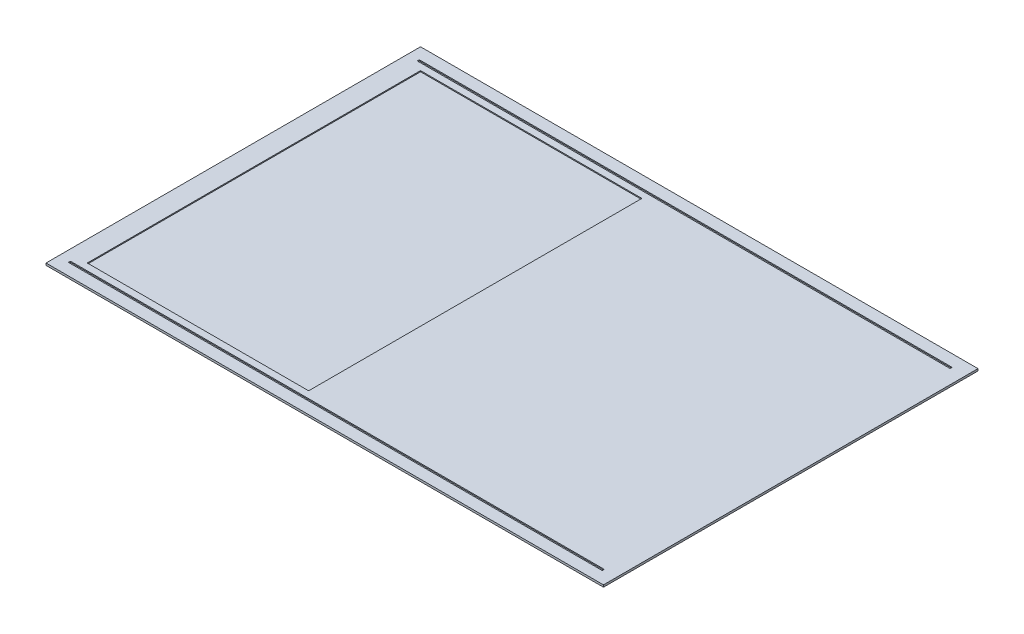
ISO-10303-21;
HEADER;
FILE_DESCRIPTION(('STEP AP214'),'2;1');
FILE_NAME('part.step','',(''),(''),'','','');
FILE_SCHEMA(('AUTOMOTIVE_DESIGN { 1 0 10303 214 1 1 1 1 }'));
ENDSEC;
DATA;
#1=APPLICATION_CONTEXT('core data for automotive mechanical design processes');
#2=APPLICATION_PROTOCOL_DEFINITION('international standard','automotive_design',2000,#1);
#3=PRODUCT_CONTEXT('',#1,'mechanical');
#4=PRODUCT('Part','Part','',(#3));
#5=PRODUCT_RELATED_PRODUCT_CATEGORY('part','',(#4));
#6=PRODUCT_DEFINITION_FORMATION('','',#4);
#7=PRODUCT_DEFINITION_CONTEXT('part definition',#1,'design');
#8=PRODUCT_DEFINITION('design','',#6,#7);
#9=PRODUCT_DEFINITION_SHAPE('','',#8);
#10=(LENGTH_UNIT() NAMED_UNIT(*) SI_UNIT(.MILLI.,.METRE.));
#11=(NAMED_UNIT(*) PLANE_ANGLE_UNIT() SI_UNIT($,.RADIAN.));
#12=(NAMED_UNIT(*) SI_UNIT($,.STERADIAN.) SOLID_ANGLE_UNIT());
#13=UNCERTAINTY_MEASURE_WITH_UNIT(LENGTH_MEASURE(1.E-05),#10,'distance_accuracy_value','');
#14=(GEOMETRIC_REPRESENTATION_CONTEXT(3) GLOBAL_UNCERTAINTY_ASSIGNED_CONTEXT((#13)) GLOBAL_UNIT_ASSIGNED_CONTEXT((#10,
#11,#12)) REPRESENTATION_CONTEXT('',''));
#15=CARTESIAN_POINT('',(0.,0.,0.));
#16=DIRECTION('',(0.,0.,1.));
#17=DIRECTION('',(1.,0.,0.));
#18=AXIS2_PLACEMENT_3D('',#15,#16,#17);
#19=CARTESIAN_POINT('',(0.,20.,0.));
#20=DIRECTION('',(0.,1.,0.));
#21=DIRECTION('',(0.,0.,1.));
#22=AXIS2_PLACEMENT_3D('',#19,#20,#21);
#23=PLANE('',#22);
#24=DIRECTION('',(0.,0.,1.));
#25=VECTOR('',#24,1.);
#26=CARTESIAN_POINT('',(-2700.13226016902,20.,709.245671205346));
#27=LINE('',#26,#25);
#28=CARTESIAN_POINT('',(-2700.13226016902,20.,709.245671205346));
#29=VERTEX_POINT('',#28);
#30=CARTESIAN_POINT('',(-2700.13226016902,20.,729.245671205346));
#31=VERTEX_POINT('',#30);
#32=EDGE_CURVE('E158',#29,#31,#27,.T.);
#33=ORIENTED_EDGE('',*,*,#32,.F.);
#34=DIRECTION('',(1.,0.,0.));
#35=VECTOR('',#34,1.);
#36=CARTESIAN_POINT('',(-2700.13226016902,20.,709.245671205346));
#37=LINE('',#36,#35);
#38=CARTESIAN_POINT('',(2460.61811379552,20.,709.245671205346));
#39=VERTEX_POINT('',#38);
#40=EDGE_CURVE('E174',#29,#39,#37,.T.);
#41=ORIENTED_EDGE('',*,*,#40,.T.);
#42=DIRECTION('',(0.,0.,-1.));
#43=VECTOR('',#42,1.);
#44=CARTESIAN_POINT('',(2460.61811379552,20.,729.245671205346));
#45=LINE('',#44,#43);
#46=CARTESIAN_POINT('',(2460.61811379552,20.,729.245671205346));
#47=VERTEX_POINT('',#46);
#48=EDGE_CURVE('E181',#47,#39,#45,.T.);
#49=ORIENTED_EDGE('',*,*,#48,.F.);
#50=DIRECTION('',(1.,0.,0.));
#51=VECTOR('',#50,1.);
#52=CARTESIAN_POINT('',(-2700.13226016902,20.,729.245671205346));
#53=LINE('',#52,#51);
#54=EDGE_CURVE('E179',#31,#47,#53,.T.);
#55=ORIENTED_EDGE('',*,*,#54,.F.);
#56=EDGE_LOOP('',(#33,#41,#49,#55));
#57=FACE_BOUND('',#56,.T.);
#58=DIRECTION('',(1.,0.,0.));
#59=VECTOR('',#58,1.);
#60=CARTESIAN_POINT('',(0.,20.,4022.65256797583));
#61=LINE('',#60,#59);
#62=CARTESIAN_POINT('',(-2603.77643504532,20.,4022.65256797583));
#63=VERTEX_POINT('',#62);
#64=CARTESIAN_POINT('',(-459.676435045316,20.,4022.65256797583));
#65=VERTEX_POINT('',#64);
#66=EDGE_CURVE('E229',#63,#65,#61,.T.);
#67=ORIENTED_EDGE('',*,*,#66,.F.);
#68=DIRECTION('',(0.,0.,1.));
#69=VECTOR('',#68,1.);
#70=CARTESIAN_POINT('',(-2603.77643504532,20.,7.16424423584565E-13));
#71=LINE('',#70,#69);
#72=CARTESIAN_POINT('',(-2603.77643504532,20.,794.652567975834));
#73=VERTEX_POINT('',#72);
#74=EDGE_CURVE('E232',#73,#63,#71,.T.);
#75=ORIENTED_EDGE('',*,*,#74,.F.);
#76=DIRECTION('',(1.,0.,0.));
#77=VECTOR('',#76,1.);
#78=CARTESIAN_POINT('',(0.,20.,794.652567975834));
#79=LINE('',#78,#77);
#80=CARTESIAN_POINT('',(-459.676435045317,20.,794.652567975834));
#81=VERTEX_POINT('',#80);
#82=EDGE_CURVE('E236',#73,#81,#79,.T.);
#83=ORIENTED_EDGE('',*,*,#82,.T.);
#84=DIRECTION('',(0.,0.,1.));
#85=VECTOR('',#84,1.);
#86=CARTESIAN_POINT('',(-459.676435045317,20.,0.));
#87=LINE('',#86,#85);
#88=EDGE_CURVE('E238',#81,#65,#87,.T.);
#89=ORIENTED_EDGE('',*,*,#88,.T.);
#90=EDGE_LOOP('',(#67,#75,#83,#89));
#91=FACE_BOUND('',#90,.T.);
#92=DIRECTION('',(1.,0.,0.));
#93=VECTOR('',#92,1.);
#94=CARTESIAN_POINT('',(0.,20.,4222.65256797583));
#95=LINE('',#94,#93);
#96=CARTESIAN_POINT('',(-2803.77643504532,20.,4222.65256797583));
#97=VERTEX_POINT('',#96);
#98=CARTESIAN_POINT('',(2596.22356495468,20.,4222.65256797583));
#99=VERTEX_POINT('',#98);
#100=EDGE_CURVE('E240',#97,#99,#95,.T.);
#101=ORIENTED_EDGE('',*,*,#100,.T.);
#102=DIRECTION('',(0.,0.,-1.));
#103=VECTOR('',#102,1.);
#104=CARTESIAN_POINT('',(2596.22356495468,20.,0.));
#105=LINE('',#104,#103);
#106=CARTESIAN_POINT('',(2596.22356495468,20.,594.652567975834));
#107=VERTEX_POINT('',#106);
#108=EDGE_CURVE('E243',#99,#107,#105,.T.);
#109=ORIENTED_EDGE('',*,*,#108,.T.);
#110=DIRECTION('',(-1.,0.,0.));
#111=VECTOR('',#110,1.);
#112=CARTESIAN_POINT('',(0.,20.,594.652567975835));
#113=LINE('',#112,#111);
#114=CARTESIAN_POINT('',(-2803.77643504532,20.,594.652567975835));
#115=VERTEX_POINT('',#114);
#116=EDGE_CURVE('E245',#107,#115,#113,.T.);
#117=ORIENTED_EDGE('',*,*,#116,.T.);
#118=DIRECTION('',(0.,0.,1.));
#119=VECTOR('',#118,1.);
#120=CARTESIAN_POINT('',(-2803.77643504532,20.,6.86398490427509E-13));
#121=LINE('',#120,#119);
#122=EDGE_CURVE('E247',#115,#97,#121,.T.);
#123=ORIENTED_EDGE('',*,*,#122,.T.);
#124=EDGE_LOOP('',(#101,#109,#117,#123));
#125=FACE_BOUND('',#124,.T.);
#126=DIRECTION('',(0.,0.,1.));
#127=VECTOR('',#126,1.);
#128=CARTESIAN_POINT('',(-2700.13226016902,20.,4088.65256797583));
#129=LINE('',#128,#127);
#130=CARTESIAN_POINT('',(-2700.13226016902,20.,4088.65256797583));
#131=VERTEX_POINT('',#130);
#132=CARTESIAN_POINT('',(-2700.13226016902,20.,4108.65256797583));
#133=VERTEX_POINT('',#132);
#134=EDGE_CURVE('E202',#131,#133,#129,.T.);
#135=ORIENTED_EDGE('',*,*,#134,.F.);
#136=DIRECTION('',(1.,0.,0.));
#137=VECTOR('',#136,1.);
#138=CARTESIAN_POINT('',(-2700.13226016902,20.,4088.65256797583));
#139=LINE('',#138,#137);
#140=CARTESIAN_POINT('',(2470.6647592355,20.,4088.65256797583));
#141=VERTEX_POINT('',#140);
#142=EDGE_CURVE('E62',#131,#141,#139,.T.);
#143=ORIENTED_EDGE('',*,*,#142,.T.);
#144=DIRECTION('',(0.,0.,1.));
#145=VECTOR('',#144,1.);
#146=CARTESIAN_POINT('',(2470.6647592355,20.,4088.65256797583));
#147=LINE('',#146,#145);
#148=CARTESIAN_POINT('',(2470.6647592355,20.,4108.65256797583));
#149=VERTEX_POINT('',#148);
#150=EDGE_CURVE('E208',#141,#149,#147,.T.);
#151=ORIENTED_EDGE('',*,*,#150,.T.);
#152=DIRECTION('',(1.,0.,0.));
#153=VECTOR('',#152,1.);
#154=CARTESIAN_POINT('',(-2700.13226016902,20.,4108.65256797583));
#155=LINE('',#154,#153);
#156=EDGE_CURVE('E204',#133,#149,#155,.T.);
#157=ORIENTED_EDGE('',*,*,#156,.F.);
#158=EDGE_LOOP('',(#135,#143,#151,#157));
#159=FACE_BOUND('',#158,.T.);
#160=ADVANCED_FACE('F37',(#57,#91,#125,#159),#23,.T.);
#161=CARTESIAN_POINT('',(0.,20.,4222.65256797583));
#162=DIRECTION('',(0.,0.,-1.));
#163=DIRECTION('',(-1.,0.,0.));
#164=AXIS2_PLACEMENT_3D('',#161,#162,#163);
#165=PLANE('',#164);
#166=DIRECTION('',(1.,0.,0.));
#167=VECTOR('',#166,1.);
#168=CARTESIAN_POINT('',(0.,0.,4222.65256797583));
#169=LINE('',#168,#167);
#170=CARTESIAN_POINT('',(-2803.77643504532,0.,4222.65256797583));
#171=VERTEX_POINT('',#170);
#172=CARTESIAN_POINT('',(2596.22356495468,0.,4222.65256797583));
#173=VERTEX_POINT('',#172);
#174=EDGE_CURVE('E228',#171,#173,#169,.T.);
#175=ORIENTED_EDGE('',*,*,#174,.T.);
#176=DIRECTION('',(0.,-1.,0.));
#177=VECTOR('',#176,1.);
#178=CARTESIAN_POINT('',(2596.22356495468,20.,4222.65256797583));
#179=LINE('',#178,#177);
#180=EDGE_CURVE('E11',#99,#173,#179,.T.);
#181=ORIENTED_EDGE('',*,*,#180,.F.);
#182=ORIENTED_EDGE('',*,*,#100,.F.);
#183=DIRECTION('',(0.,-1.,0.));
#184=VECTOR('',#183,1.);
#185=CARTESIAN_POINT('',(-2803.77643504532,20.,4222.65256797583));
#186=LINE('',#185,#184);
#187=EDGE_CURVE('E257',#97,#171,#186,.T.);
#188=ORIENTED_EDGE('',*,*,#187,.T.);
#189=EDGE_LOOP('',(#175,#181,#182,#188));
#190=FACE_BOUND('',#189,.T.);
#191=ADVANCED_FACE('F302',(#190),#165,.F.);
#192=CARTESIAN_POINT('',(2596.22356495468,20.,0.));
#193=DIRECTION('',(-1.,0.,0.));
#194=DIRECTION('',(0.,0.,1.));
#195=AXIS2_PLACEMENT_3D('',#192,#193,#194);
#196=PLANE('',#195);
#197=DIRECTION('',(0.,0.,-1.));
#198=VECTOR('',#197,1.);
#199=CARTESIAN_POINT('',(2596.22356495468,0.,0.));
#200=LINE('',#199,#198);
#201=CARTESIAN_POINT('',(2596.22356495468,0.,594.652567975834));
#202=VERTEX_POINT('',#201);
#203=EDGE_CURVE('E252',#173,#202,#200,.T.);
#204=ORIENTED_EDGE('',*,*,#203,.T.);
#205=DIRECTION('',(0.,-1.,0.));
#206=VECTOR('',#205,1.);
#207=CARTESIAN_POINT('',(2596.22356495468,20.,594.652567975834));
#208=LINE('',#207,#206);
#209=EDGE_CURVE('E46',#107,#202,#208,.T.);
#210=ORIENTED_EDGE('',*,*,#209,.F.);
#211=ORIENTED_EDGE('',*,*,#108,.F.);
#212=ORIENTED_EDGE('',*,*,#180,.T.);
#213=EDGE_LOOP('',(#204,#210,#211,#212));
#214=FACE_BOUND('',#213,.T.);
#215=ADVANCED_FACE('F310',(#214),#196,.F.);
#216=CARTESIAN_POINT('',(0.,20.,594.652567975835));
#217=DIRECTION('',(0.,0.,1.));
#218=DIRECTION('',(1.,0.,0.));
#219=AXIS2_PLACEMENT_3D('',#216,#217,#218);
#220=PLANE('',#219);
#221=DIRECTION('',(-1.,0.,0.));
#222=VECTOR('',#221,1.);
#223=CARTESIAN_POINT('',(0.,0.,594.652567975835));
#224=LINE('',#223,#222);
#225=CARTESIAN_POINT('',(-2803.77643504532,0.,594.652567975835));
#226=VERTEX_POINT('',#225);
#227=EDGE_CURVE('E254',#202,#226,#224,.T.);
#228=ORIENTED_EDGE('',*,*,#227,.T.);
#229=DIRECTION('',(0.,-1.,0.));
#230=VECTOR('',#229,1.);
#231=CARTESIAN_POINT('',(-2803.77643504532,20.,594.652567975835));
#232=LINE('',#231,#230);
#233=EDGE_CURVE('E260',#115,#226,#232,.T.);
#234=ORIENTED_EDGE('',*,*,#233,.F.);
#235=ORIENTED_EDGE('',*,*,#116,.F.);
#236=ORIENTED_EDGE('',*,*,#209,.T.);
#237=EDGE_LOOP('',(#228,#234,#235,#236));
#238=FACE_BOUND('',#237,.T.);
#239=ADVANCED_FACE('F323',(#238),#220,.F.);
#240=CARTESIAN_POINT('',(0.,20.,4022.65256797583));
#241=DIRECTION('',(0.,0.,-1.));
#242=DIRECTION('',(-1.,0.,0.));
#243=AXIS2_PLACEMENT_3D('',#240,#241,#242);
#244=PLANE('',#243);
#245=DIRECTION('',(1.,0.,0.));
#246=VECTOR('',#245,1.);
#247=CARTESIAN_POINT('',(-2603.77643504532,10.,4022.65256797583));
#248=LINE('',#247,#246);
#249=CARTESIAN_POINT('',(-2603.77643504532,10.,4022.65256797583));
#250=VERTEX_POINT('',#249);
#251=CARTESIAN_POINT('',(-459.676435045316,10.,4022.65256797583));
#252=VERTEX_POINT('',#251);
#253=EDGE_CURVE('E222',#250,#252,#248,.T.);
#254=ORIENTED_EDGE('',*,*,#253,.F.);
#255=DIRECTION('',(0.,-1.,0.));
#256=VECTOR('',#255,1.);
#257=CARTESIAN_POINT('',(-2603.77643504532,20.,4022.65256797583));
#258=LINE('',#257,#256);
#259=EDGE_CURVE('E41',#63,#250,#258,.T.);
#260=ORIENTED_EDGE('',*,*,#259,.F.);
#261=ORIENTED_EDGE('',*,*,#66,.T.);
#262=DIRECTION('',(0.,-1.,0.));
#263=VECTOR('',#262,1.);
#264=CARTESIAN_POINT('',(-459.676435045316,20.,4022.65256797583));
#265=LINE('',#264,#263);
#266=EDGE_CURVE('E249',#65,#252,#265,.T.);
#267=ORIENTED_EDGE('',*,*,#266,.T.);
#268=EDGE_LOOP('',(#254,#260,#261,#267));
#269=FACE_BOUND('',#268,.T.);
#270=ADVANCED_FACE('F39',(#269),#244,.T.);
#271=CARTESIAN_POINT('',(-2603.77643504532,20.,7.16424423584565E-13));
#272=DIRECTION('',(1.,0.,0.));
#273=DIRECTION('',(0.,0.,-1.));
#274=AXIS2_PLACEMENT_3D('',#271,#272,#273);
#275=PLANE('',#274);
#276=DIRECTION('',(0.,0.,1.));
#277=VECTOR('',#276,1.);
#278=CARTESIAN_POINT('',(-2603.77643504532,10.,794.652567975834));
#279=LINE('',#278,#277);
#280=CARTESIAN_POINT('',(-2603.77643504532,10.,794.652567975834));
#281=VERTEX_POINT('',#280);
#282=EDGE_CURVE('E188',#281,#250,#279,.T.);
#283=ORIENTED_EDGE('',*,*,#282,.F.);
#284=DIRECTION('',(0.,-1.,0.));
#285=VECTOR('',#284,1.);
#286=CARTESIAN_POINT('',(-2603.77643504532,20.,794.652567975834));
#287=LINE('',#286,#285);
#288=EDGE_CURVE('E269',#73,#281,#287,.T.);
#289=ORIENTED_EDGE('',*,*,#288,.F.);
#290=ORIENTED_EDGE('',*,*,#74,.T.);
#291=ORIENTED_EDGE('',*,*,#259,.T.);
#292=EDGE_LOOP('',(#283,#289,#290,#291));
#293=FACE_BOUND('',#292,.T.);
#294=ADVANCED_FACE('F277',(#293),#275,.T.);
#295=CARTESIAN_POINT('',(0.,20.,794.652567975834));
#296=DIRECTION('',(0.,0.,-1.));
#297=DIRECTION('',(-1.,0.,0.));
#298=AXIS2_PLACEMENT_3D('',#295,#296,#297);
#299=PLANE('',#298);
#300=ORIENTED_EDGE('',*,*,#288,.T.);
#301=DIRECTION('',(-1.,0.,0.));
#302=VECTOR('',#301,1.);
#303=CARTESIAN_POINT('',(-2603.77643504532,10.,794.652567975834));
#304=LINE('',#303,#302);
#305=CARTESIAN_POINT('',(-459.676435045316,10.,794.652567975834));
#306=VERTEX_POINT('',#305);
#307=EDGE_CURVE('E226',#306,#281,#304,.T.);
#308=ORIENTED_EDGE('',*,*,#307,.F.);
#309=DIRECTION('',(0.,-1.,0.));
#310=VECTOR('',#309,1.);
#311=CARTESIAN_POINT('',(-459.676435045317,20.,794.652567975834));
#312=LINE('',#311,#310);
#313=EDGE_CURVE('E267',#81,#306,#312,.T.);
#314=ORIENTED_EDGE('',*,*,#313,.F.);
#315=ORIENTED_EDGE('',*,*,#82,.F.);
#316=EDGE_LOOP('',(#300,#308,#314,#315));
#317=FACE_BOUND('',#316,.T.);
#318=ADVANCED_FACE('F292',(#317),#299,.F.);
#319=CARTESIAN_POINT('',(-459.676435045317,20.,0.));
#320=DIRECTION('',(1.,0.,0.));
#321=DIRECTION('',(0.,0.,-1.));
#322=AXIS2_PLACEMENT_3D('',#319,#320,#321);
#323=PLANE('',#322);
#324=ORIENTED_EDGE('',*,*,#313,.T.);
#325=DIRECTION('',(0.,0.,-1.));
#326=VECTOR('',#325,1.);
#327=CARTESIAN_POINT('',(-459.676435045316,10.,794.652567975834));
#328=LINE('',#327,#326);
#329=EDGE_CURVE('E224',#252,#306,#328,.T.);
#330=ORIENTED_EDGE('',*,*,#329,.F.);
#331=ORIENTED_EDGE('',*,*,#266,.F.);
#332=ORIENTED_EDGE('',*,*,#88,.F.);
#333=EDGE_LOOP('',(#324,#330,#331,#332));
#334=FACE_BOUND('',#333,.T.);
#335=ADVANCED_FACE('F289',(#334),#323,.F.);
#336=CARTESIAN_POINT('',(-2803.77643504532,20.,6.86398490427509E-13));
#337=DIRECTION('',(1.,0.,0.));
#338=DIRECTION('',(0.,0.,-1.));
#339=AXIS2_PLACEMENT_3D('',#336,#337,#338);
#340=PLANE('',#339);
#341=DIRECTION('',(0.,0.,1.));
#342=VECTOR('',#341,1.);
#343=CARTESIAN_POINT('',(-2803.77643504532,0.,6.86398490427509E-13));
#344=LINE('',#343,#342);
#345=EDGE_CURVE('E233',#226,#171,#344,.T.);
#346=ORIENTED_EDGE('',*,*,#345,.T.);
#347=ORIENTED_EDGE('',*,*,#187,.F.);
#348=ORIENTED_EDGE('',*,*,#122,.F.);
#349=ORIENTED_EDGE('',*,*,#233,.T.);
#350=EDGE_LOOP('',(#346,#347,#348,#349));
#351=FACE_BOUND('',#350,.T.);
#352=ADVANCED_FACE('F299',(#351),#340,.F.);
#353=CARTESIAN_POINT('',(0.,0.,0.));
#354=DIRECTION('',(0.,1.,0.));
#355=DIRECTION('',(0.,0.,1.));
#356=AXIS2_PLACEMENT_3D('',#353,#354,#355);
#357=PLANE('',#356);
#358=ORIENTED_EDGE('',*,*,#174,.F.);
#359=ORIENTED_EDGE('',*,*,#345,.F.);
#360=ORIENTED_EDGE('',*,*,#227,.F.);
#361=ORIENTED_EDGE('',*,*,#203,.F.);
#362=EDGE_LOOP('',(#358,#359,#360,#361));
#363=FACE_BOUND('',#362,.T.);
#364=ADVANCED_FACE('F316',(#363),#357,.F.);
#365=CARTESIAN_POINT('',(0.,10.,0.));
#366=DIRECTION('',(0.,1.,0.));
#367=DIRECTION('',(0.,0.,1.));
#368=AXIS2_PLACEMENT_3D('',#365,#366,#367);
#369=PLANE('',#368);
#370=ORIENTED_EDGE('',*,*,#282,.T.);
#371=ORIENTED_EDGE('',*,*,#253,.T.);
#372=ORIENTED_EDGE('',*,*,#329,.T.);
#373=ORIENTED_EDGE('',*,*,#307,.T.);
#374=EDGE_LOOP('',(#370,#371,#372,#373));
#375=FACE_BOUND('',#374,.T.);
#376=ADVANCED_FACE('F291',(#375),#369,.T.);
#377=CARTESIAN_POINT('',(-2700.13226016902,10.,4088.65256797583));
#378=DIRECTION('',(0.,0.,1.));
#379=DIRECTION('',(1.,0.,0.));
#380=AXIS2_PLACEMENT_3D('',#377,#378,#379);
#381=PLANE('',#380);
#382=ORIENTED_EDGE('',*,*,#142,.F.);
#383=DIRECTION('',(0.,1.,0.));
#384=VECTOR('',#383,1.);
#385=CARTESIAN_POINT('',(-2700.13226016902,10.,4088.65256797583));
#386=LINE('',#385,#384);
#387=CARTESIAN_POINT('',(-2700.13226016902,10.,4088.65256797583));
#388=VERTEX_POINT('',#387);
#389=EDGE_CURVE('E199',#388,#131,#386,.T.);
#390=ORIENTED_EDGE('',*,*,#389,.F.);
#391=DIRECTION('',(1.,0.,0.));
#392=VECTOR('',#391,1.);
#393=CARTESIAN_POINT('',(-2700.13226016902,10.,4088.65256797583));
#394=LINE('',#393,#392);
#395=CARTESIAN_POINT('',(2470.6647592355,10.,4088.65256797583));
#396=VERTEX_POINT('',#395);
#397=EDGE_CURVE('E205',#388,#396,#394,.T.);
#398=ORIENTED_EDGE('',*,*,#397,.T.);
#399=DIRECTION('',(0.,1.,0.));
#400=VECTOR('',#399,1.);
#401=CARTESIAN_POINT('',(2470.6647592355,10.,4088.65256797583));
#402=LINE('',#401,#400);
#403=EDGE_CURVE('E192',#396,#141,#402,.T.);
#404=ORIENTED_EDGE('',*,*,#403,.T.);
#405=EDGE_LOOP('',(#382,#390,#398,#404));
#406=FACE_BOUND('',#405,.T.);
#407=ADVANCED_FACE('F353',(#406),#381,.T.);
#408=CARTESIAN_POINT('',(2470.6647592355,10.,4088.65256797583));
#409=DIRECTION('',(-1.,0.,0.));
#410=DIRECTION('',(0.,0.,1.));
#411=AXIS2_PLACEMENT_3D('',#408,#409,#410);
#412=PLANE('',#411);
#413=ORIENTED_EDGE('',*,*,#150,.F.);
#414=ORIENTED_EDGE('',*,*,#403,.F.);
#415=DIRECTION('',(0.,0.,1.));
#416=VECTOR('',#415,1.);
#417=CARTESIAN_POINT('',(2470.6647592355,10.,4088.65256797583));
#418=LINE('',#417,#416);
#419=CARTESIAN_POINT('',(2470.6647592355,10.,4108.65256797583));
#420=VERTEX_POINT('',#419);
#421=EDGE_CURVE('E217',#396,#420,#418,.T.);
#422=ORIENTED_EDGE('',*,*,#421,.T.);
#423=DIRECTION('',(0.,1.,0.));
#424=VECTOR('',#423,1.);
#425=CARTESIAN_POINT('',(2470.6647592355,10.,4108.65256797583));
#426=LINE('',#425,#424);
#427=EDGE_CURVE('E194',#420,#149,#426,.T.);
#428=ORIENTED_EDGE('',*,*,#427,.T.);
#429=EDGE_LOOP('',(#413,#414,#422,#428));
#430=FACE_BOUND('',#429,.T.);
#431=ADVANCED_FACE('F356',(#430),#412,.T.);
#432=CARTESIAN_POINT('',(-2700.13226016902,10.,4108.65256797583));
#433=DIRECTION('',(0.,0.,1.));
#434=DIRECTION('',(1.,0.,0.));
#435=AXIS2_PLACEMENT_3D('',#432,#433,#434);
#436=PLANE('',#435);
#437=ORIENTED_EDGE('',*,*,#156,.T.);
#438=ORIENTED_EDGE('',*,*,#427,.F.);
#439=DIRECTION('',(1.,0.,0.));
#440=VECTOR('',#439,1.);
#441=CARTESIAN_POINT('',(-2700.13226016902,10.,4108.65256797583));
#442=LINE('',#441,#440);
#443=CARTESIAN_POINT('',(-2700.13226016902,10.,4108.65256797583));
#444=VERTEX_POINT('',#443);
#445=EDGE_CURVE('E214',#444,#420,#442,.T.);
#446=ORIENTED_EDGE('',*,*,#445,.F.);
#447=DIRECTION('',(0.,1.,0.));
#448=VECTOR('',#447,1.);
#449=CARTESIAN_POINT('',(-2700.13226016902,10.,4108.65256797583));
#450=LINE('',#449,#448);
#451=EDGE_CURVE('E196',#444,#133,#450,.T.);
#452=ORIENTED_EDGE('',*,*,#451,.T.);
#453=EDGE_LOOP('',(#437,#438,#446,#452));
#454=FACE_BOUND('',#453,.T.);
#455=ADVANCED_FACE('F348',(#454),#436,.F.);
#456=CARTESIAN_POINT('',(-2700.13226016902,10.,4088.65256797583));
#457=DIRECTION('',(-1.,0.,0.));
#458=DIRECTION('',(0.,0.,1.));
#459=AXIS2_PLACEMENT_3D('',#456,#457,#458);
#460=PLANE('',#459);
#461=ORIENTED_EDGE('',*,*,#134,.T.);
#462=ORIENTED_EDGE('',*,*,#451,.F.);
#463=DIRECTION('',(0.,0.,1.));
#464=VECTOR('',#463,1.);
#465=CARTESIAN_POINT('',(-2700.13226016902,10.,4098.65256797583));
#466=LINE('',#465,#464);
#467=EDGE_CURVE('E201',#388,#444,#466,.T.);
#468=ORIENTED_EDGE('',*,*,#467,.F.);
#469=ORIENTED_EDGE('',*,*,#389,.T.);
#470=EDGE_LOOP('',(#461,#462,#468,#469));
#471=FACE_BOUND('',#470,.T.);
#472=ADVANCED_FACE('F345',(#471),#460,.F.);
#473=CARTESIAN_POINT('',(0.,10.,0.));
#474=DIRECTION('',(0.,-1.,0.));
#475=DIRECTION('',(0.,0.,-1.));
#476=AXIS2_PLACEMENT_3D('',#473,#474,#475);
#477=PLANE('',#476);
#478=ORIENTED_EDGE('',*,*,#397,.F.);
#479=ORIENTED_EDGE('',*,*,#467,.T.);
#480=ORIENTED_EDGE('',*,*,#445,.T.);
#481=ORIENTED_EDGE('',*,*,#421,.F.);
#482=EDGE_LOOP('',(#478,#479,#480,#481));
#483=FACE_BOUND('',#482,.T.);
#484=ADVANCED_FACE('F352',(#483),#477,.F.);
#485=CARTESIAN_POINT('',(-2700.13226016902,10.,709.245671205346));
#486=DIRECTION('',(-1.,0.,0.));
#487=DIRECTION('',(0.,0.,1.));
#488=AXIS2_PLACEMENT_3D('',#485,#486,#487);
#489=PLANE('',#488);
#490=ORIENTED_EDGE('',*,*,#32,.T.);
#491=DIRECTION('',(0.,1.,0.));
#492=VECTOR('',#491,1.);
#493=CARTESIAN_POINT('',(-2700.13226016902,10.,729.245671205346));
#494=LINE('',#493,#492);
#495=CARTESIAN_POINT('',(-2700.13226016902,10.,729.245671205346));
#496=VERTEX_POINT('',#495);
#497=EDGE_CURVE('E54',#496,#31,#494,.T.);
#498=ORIENTED_EDGE('',*,*,#497,.F.);
#499=DIRECTION('',(0.,0.,1.));
#500=VECTOR('',#499,1.);
#501=CARTESIAN_POINT('',(-2700.13226016902,10.,718.652567975834));
#502=LINE('',#501,#500);
#503=CARTESIAN_POINT('',(-2700.13226016902,10.,709.245671205346));
#504=VERTEX_POINT('',#503);
#505=EDGE_CURVE('E155',#504,#496,#502,.T.);
#506=ORIENTED_EDGE('',*,*,#505,.F.);
#507=DIRECTION('',(0.,1.,0.));
#508=VECTOR('',#507,1.);
#509=CARTESIAN_POINT('',(-2700.13226016902,10.,709.245671205346));
#510=LINE('',#509,#508);
#511=EDGE_CURVE('E186',#504,#29,#510,.T.);
#512=ORIENTED_EDGE('',*,*,#511,.T.);
#513=EDGE_LOOP('',(#490,#498,#506,#512));
#514=FACE_BOUND('',#513,.T.);
#515=ADVANCED_FACE('F153',(#514),#489,.F.);
#516=CARTESIAN_POINT('',(-2700.13226016902,10.,709.245671205346));
#517=DIRECTION('',(0.,0.,1.));
#518=DIRECTION('',(1.,0.,0.));
#519=AXIS2_PLACEMENT_3D('',#516,#517,#518);
#520=PLANE('',#519);
#521=ORIENTED_EDGE('',*,*,#40,.F.);
#522=ORIENTED_EDGE('',*,*,#511,.F.);
#523=DIRECTION('',(1.,0.,0.));
#524=VECTOR('',#523,1.);
#525=CARTESIAN_POINT('',(-2700.13226016902,10.,709.245671205346));
#526=LINE('',#525,#524);
#527=CARTESIAN_POINT('',(2460.61811379552,10.,709.245671205346));
#528=VERTEX_POINT('',#527);
#529=EDGE_CURVE('E161',#504,#528,#526,.T.);
#530=ORIENTED_EDGE('',*,*,#529,.T.);
#531=DIRECTION('',(0.,1.,0.));
#532=VECTOR('',#531,1.);
#533=CARTESIAN_POINT('',(2460.61811379552,10.,709.245671205346));
#534=LINE('',#533,#532);
#535=EDGE_CURVE('E189',#528,#39,#534,.T.);
#536=ORIENTED_EDGE('',*,*,#535,.T.);
#537=EDGE_LOOP('',(#521,#522,#530,#536));
#538=FACE_BOUND('',#537,.T.);
#539=ADVANCED_FACE('F372',(#538),#520,.T.);
#540=CARTESIAN_POINT('',(2460.61811379552,10.,729.245671205346));
#541=DIRECTION('',(1.,0.,0.));
#542=DIRECTION('',(0.,0.,-1.));
#543=AXIS2_PLACEMENT_3D('',#540,#541,#542);
#544=PLANE('',#543);
#545=ORIENTED_EDGE('',*,*,#48,.T.);
#546=ORIENTED_EDGE('',*,*,#535,.F.);
#547=DIRECTION('',(0.,0.,-1.));
#548=VECTOR('',#547,1.);
#549=CARTESIAN_POINT('',(2460.61811379552,10.,729.245671205346));
#550=LINE('',#549,#548);
#551=CARTESIAN_POINT('',(2460.61811379552,10.,729.245671205346));
#552=VERTEX_POINT('',#551);
#553=EDGE_CURVE('E169',#552,#528,#550,.T.);
#554=ORIENTED_EDGE('',*,*,#553,.F.);
#555=DIRECTION('',(0.,1.,0.));
#556=VECTOR('',#555,1.);
#557=CARTESIAN_POINT('',(2460.61811379552,10.,729.245671205346));
#558=LINE('',#557,#556);
#559=EDGE_CURVE('E160',#552,#47,#558,.T.);
#560=ORIENTED_EDGE('',*,*,#559,.T.);
#561=EDGE_LOOP('',(#545,#546,#554,#560));
#562=FACE_BOUND('',#561,.T.);
#563=ADVANCED_FACE('F377',(#562),#544,.F.);
#564=CARTESIAN_POINT('',(-2700.13226016902,10.,729.245671205346));
#565=DIRECTION('',(0.,0.,1.));
#566=DIRECTION('',(1.,0.,0.));
#567=AXIS2_PLACEMENT_3D('',#564,#565,#566);
#568=PLANE('',#567);
#569=ORIENTED_EDGE('',*,*,#54,.T.);
#570=ORIENTED_EDGE('',*,*,#559,.F.);
#571=DIRECTION('',(1.,0.,0.));
#572=VECTOR('',#571,1.);
#573=CARTESIAN_POINT('',(-2700.13226016902,10.,729.245671205346));
#574=LINE('',#573,#572);
#575=EDGE_CURVE('E164',#496,#552,#574,.T.);
#576=ORIENTED_EDGE('',*,*,#575,.F.);
#577=ORIENTED_EDGE('',*,*,#497,.T.);
#578=EDGE_LOOP('',(#569,#570,#576,#577));
#579=FACE_BOUND('',#578,.T.);
#580=ADVANCED_FACE('F165',(#579),#568,.F.);
#581=CARTESIAN_POINT('',(0.,10.,0.));
#582=DIRECTION('',(0.,1.,0.));
#583=DIRECTION('',(0.,0.,1.));
#584=AXIS2_PLACEMENT_3D('',#581,#582,#583);
#585=PLANE('',#584);
#586=ORIENTED_EDGE('',*,*,#505,.T.);
#587=ORIENTED_EDGE('',*,*,#575,.T.);
#588=ORIENTED_EDGE('',*,*,#553,.T.);
#589=ORIENTED_EDGE('',*,*,#529,.F.);
#590=EDGE_LOOP('',(#586,#587,#588,#589));
#591=FACE_BOUND('',#590,.T.);
#592=ADVANCED_FACE('F172',(#591),#585,.T.);
#593=CLOSED_SHELL('',(#160,#191,#215,#239,#270,#294,#318,#335,#352,#364,#376,#407,#431,#455,
#472,#484,#515,#539,#563,#580,#592));
#594=MANIFOLD_SOLID_BREP('B2',#593);
#595=ADVANCED_BREP_SHAPE_REPRESENTATION('',(#18,#594),#14);
#596=SHAPE_DEFINITION_REPRESENTATION(#9,#595);
ENDSEC;
END-ISO-10303-21;
